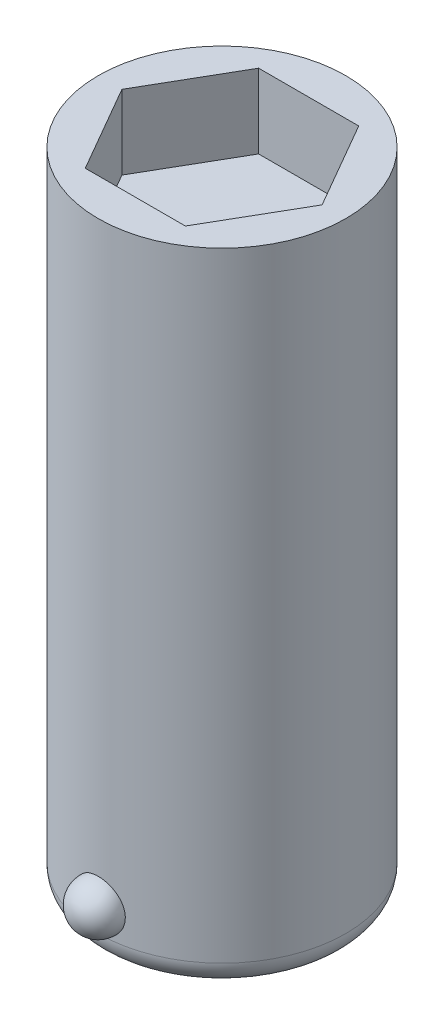
ISO-10303-21;
HEADER;
FILE_DESCRIPTION(('STEP AP214'),'2;1');
FILE_NAME('part.step','',(''),(''),'','','');
FILE_SCHEMA(('AUTOMOTIVE_DESIGN { 1 0 10303 214 1 1 1 1 }'));
ENDSEC;
DATA;
#1=APPLICATION_CONTEXT('core data for automotive mechanical design processes');
#2=APPLICATION_PROTOCOL_DEFINITION('international standard','automotive_design',2000,#1);
#3=PRODUCT_CONTEXT('',#1,'mechanical');
#4=PRODUCT('Part','Part','',(#3));
#5=PRODUCT_RELATED_PRODUCT_CATEGORY('part','',(#4));
#6=PRODUCT_DEFINITION_FORMATION('','',#4);
#7=PRODUCT_DEFINITION_CONTEXT('part definition',#1,'design');
#8=PRODUCT_DEFINITION('design','',#6,#7);
#9=PRODUCT_DEFINITION_SHAPE('','',#8);
#10=(LENGTH_UNIT() NAMED_UNIT(*) SI_UNIT(.MILLI.,.METRE.));
#11=(NAMED_UNIT(*) PLANE_ANGLE_UNIT() SI_UNIT($,.RADIAN.));
#12=(NAMED_UNIT(*) SI_UNIT($,.STERADIAN.) SOLID_ANGLE_UNIT());
#13=UNCERTAINTY_MEASURE_WITH_UNIT(LENGTH_MEASURE(1.E-05),#10,'distance_accuracy_value','');
#14=(GEOMETRIC_REPRESENTATION_CONTEXT(3) GLOBAL_UNCERTAINTY_ASSIGNED_CONTEXT((#13)) GLOBAL_UNIT_ASSIGNED_CONTEXT((#10,
#11,#12)) REPRESENTATION_CONTEXT('',''));
#15=CARTESIAN_POINT('',(0.,0.,0.));
#16=DIRECTION('',(0.,0.,1.));
#17=DIRECTION('',(1.,0.,0.));
#18=AXIS2_PLACEMENT_3D('',#15,#16,#17);
#19=CARTESIAN_POINT('',(0.,26.,0.));
#20=DIRECTION('',(0.,-1.,0.));
#21=DIRECTION('',(0.,0.,-1.));
#22=AXIS2_PLACEMENT_3D('',#19,#20,#21);
#23=CYLINDRICAL_SURFACE('',#22,5.);
#24=CARTESIAN_POINT('',(0.,0.994987437106618,0.));
#25=DIRECTION('',(0.,-1.,0.));
#26=DIRECTION('',(0.,0.,-1.));
#27=AXIS2_PLACEMENT_3D('',#24,#25,#26);
#28=CIRCLE('',#27,5.);
#29=CARTESIAN_POINT('',(0.,0.994987437106618,-5.));
#30=VERTEX_POINT('',#29);
#31=EDGE_CURVE('E11',#30,#30,#28,.F.);
#32=ORIENTED_EDGE('',*,*,#31,.T.);
#33=EDGE_LOOP('',(#32));
#34=FACE_BOUND('',#33,.T.);
#35=CARTESIAN_POINT('',(0.994987437106706,2.,4.9));
#36=CARTESIAN_POINT('',(0.99498560287014,1.94396831697695,4.90000106045254));
#37=CARTESIAN_POINT('',(0.990335655261199,1.88791073579904,4.90095166589253));
#38=CARTESIAN_POINT('',(0.971848665803341,1.77736226997428,4.90465044251787));
#39=CARTESIAN_POINT('',(0.958004476867156,1.72287263857011,4.9074000120923));
#40=CARTESIAN_POINT('',(0.92150239913956,1.61705676134784,4.91438464778238));
#41=CARTESIAN_POINT('',(0.898848550961522,1.56572907776405,4.91861903278939));
#42=CARTESIAN_POINT('',(0.845332865723616,1.46766063985218,4.92809773919241));
#43=CARTESIAN_POINT('',(0.814472092087265,1.4209192923168,4.93334192971722));
#44=CARTESIAN_POINT('',(0.745274823977119,1.33320334923897,4.94426858838759));
#45=CARTESIAN_POINT('',(0.706919382057819,1.29224383263132,4.94995214482173));
#46=CARTESIAN_POINT('',(0.623820502557111,1.21737996494551,4.96110891653895));
#47=CARTESIAN_POINT('',(0.579076950291243,1.18347574055645,4.96658212804351));
#48=CARTESIAN_POINT('',(0.484507997711316,1.12372488100045,4.97669635913741));
#49=CARTESIAN_POINT('',(0.434690387828699,1.09786613357938,4.98133862517423));
#50=CARTESIAN_POINT('',(0.331321767027698,1.05487587556066,4.9892794790187));
#51=CARTESIAN_POINT('',(0.277770967463711,1.03774387135421,4.9925781428221));
#52=CARTESIAN_POINT('',(0.168991770750412,1.01281938141677,4.99743703932135));
#53=CARTESIAN_POINT('',(0.113783790778077,1.00494090032989,4.99901326931134));
#54=CARTESIAN_POINT('',(0.00280574839069789,0.99846038664853,5.00030705156377));
#55=CARTESIAN_POINT('',(-0.0529642848279286,0.999857874659318,5.00002469988025));
#56=CARTESIAN_POINT('',(-0.163044634175729,1.01184263311872,4.99764204274201));
#57=CARTESIAN_POINT('',(-0.217362732615366,1.0223613211719,4.99555530481581));
#58=CARTESIAN_POINT('',(-0.323437202466647,1.05219813692466,4.98981075910898));
#59=CARTESIAN_POINT('',(-0.375193542531856,1.0715163722686,4.98615293210933));
#60=CARTESIAN_POINT('',(-0.474877061572509,1.1184919662299,4.97765055921629));
#61=CARTESIAN_POINT('',(-0.522790881371321,1.14617694707735,4.97280209260139));
#62=CARTESIAN_POINT('',(-0.613293841484466,1.20909823835989,4.96245389323851));
#63=CARTESIAN_POINT('',(-0.655882686619847,1.2443349671169,4.95695412441981));
#64=CARTESIAN_POINT('',(-0.734998232489791,1.32178820362403,4.94584600979191));
#65=CARTESIAN_POINT('',(-0.771459490548274,1.36407149538703,4.94023712834133));
#66=CARTESIAN_POINT('',(-0.836817313891344,1.45419241208939,4.92958788142729));
#67=CARTESIAN_POINT('',(-0.865713625679486,1.50203022307957,4.92454753501828));
#68=CARTESIAN_POINT('',(-0.915310830489436,1.60220741654454,4.91557197339426));
#69=CARTESIAN_POINT('',(-0.935966015304219,1.65456999811804,4.91164295605738));
#70=CARTESIAN_POINT('',(-0.968299634970496,1.76208737815018,4.90537147493131));
#71=CARTESIAN_POINT('',(-0.979978211499377,1.81724213252543,4.9030289861021));
#72=CARTESIAN_POINT('',(-0.994028344792453,1.92863330353786,4.90019997742686));
#73=CARTESIAN_POINT('',(-0.996422746224356,1.98486672257479,4.89970890207017));
#74=CARTESIAN_POINT('',(-0.991903453089489,2.09694201485401,4.90062573154923));
#75=CARTESIAN_POINT('',(-0.984989872516567,2.15278389288303,4.90203361312865));
#76=CARTESIAN_POINT('',(-0.962065978984036,2.26236209630438,4.90658369613697));
#77=CARTESIAN_POINT('',(-0.946076154978933,2.31610287370878,4.9097219908301));
#78=CARTESIAN_POINT('',(-0.905439545493827,2.42010030332156,4.91737776520369));
#79=CARTESIAN_POINT('',(-0.880792566721247,2.47035687770642,4.9218952756783));
#80=CARTESIAN_POINT('',(-0.823408707673632,2.5661269493201,4.93181965849537));
#81=CARTESIAN_POINT('',(-0.790647810994116,2.61162578500097,4.93722915484837));
#82=CARTESIAN_POINT('',(-0.717950321335968,2.69643891265726,4.94832250793488));
#83=CARTESIAN_POINT('',(-0.67801360527122,2.7357530985263,4.95400636937333));
#84=CARTESIAN_POINT('',(-0.591982999572354,2.8071506902601,4.96502123503072));
#85=CARTESIAN_POINT('',(-0.545880125493262,2.83922335796265,4.97035170706183));
#86=CARTESIAN_POINT('',(-0.448842527846835,2.89515463323769,4.98005164377887));
#87=CARTESIAN_POINT('',(-0.397907996873,2.91901356804045,4.98442114674673));
#88=CARTESIAN_POINT('',(-0.293023074529829,2.95769719834728,4.99168101894947));
#89=CARTESIAN_POINT('',(-0.239096258922929,2.97258389197869,4.99458151620528));
#90=CARTESIAN_POINT('',(-0.129451795906326,2.99315418320674,4.99862479266747));
#91=CARTESIAN_POINT('',(-0.0737342578870587,2.99883834187594,4.99976767903403));
#92=CARTESIAN_POINT('',(0.0373329284403417,3.00083043709395,5.00016608200714));
#93=CARTESIAN_POINT('',(0.0926809135385354,2.99722864866207,4.99943977048283));
#94=CARTESIAN_POINT('',(0.201969740239315,2.98094276533955,4.9962183365304));
#95=CARTESIAN_POINT('',(0.255910600391219,2.96825879023693,4.99372323743143));
#96=CARTESIAN_POINT('',(0.360808369575168,2.93418578849914,4.98724153108333));
#97=CARTESIAN_POINT('',(0.411768354992322,2.91280592438383,4.98325649407964));
#98=CARTESIAN_POINT('',(0.509361425920189,2.86193700219456,4.97422912870706));
#99=CARTESIAN_POINT('',(0.555994416538248,2.83244776633517,4.96918677715875));
#100=CARTESIAN_POINT('',(0.644060366517357,2.76587827308016,4.9585455278987));
#101=CARTESIAN_POINT('',(0.685444474177205,2.72873410956696,4.95294216351497));
#102=CARTESIAN_POINT('',(0.761429310549823,2.64803158579989,4.94183202558425));
#103=CARTESIAN_POINT('',(0.796028644006292,2.60447190944487,4.93632527211638));
#104=CARTESIAN_POINT('',(0.857786479384858,2.51174203804983,4.92597140076439));
#105=CARTESIAN_POINT('',(0.884877881447816,2.46252648196186,4.9211304146418));
#106=CARTESIAN_POINT('',(0.930477407488461,2.36019906325116,4.91271345168924));
#107=CARTESIAN_POINT('',(0.948992213438764,2.30709027131752,4.90913649058228));
#108=CARTESIAN_POINT('',(0.973597596884116,2.21158675404024,4.90430644223049));
#109=CARTESIAN_POINT('',(0.981606650553947,2.1696928322495,4.90270112417325));
#110=CARTESIAN_POINT('',(0.992302255052214,2.08520426359049,4.9005475024342));
#111=CARTESIAN_POINT('',(0.9949888319626,2.04260962015702,4.89999919357268));
#112=CARTESIAN_POINT('',(0.994987437106706,2.,4.9));
#113=B_SPLINE_CURVE_WITH_KNOTS('',3,(#35,#36,#37,#38,#39,#40,#41,#42,#43,#44,#45,#46,#47,#48,
#49,#50,#51,#52,#53,#54,#55,#56,#57,#58,#59,#60,#61,#62,#63,#64,#65,#66,#67,#68,#69,#70,#71,#72,
#73,#74,#75,#76,#77,#78,#79,#80,#81,#82,#83,#84,#85,#86,#87,#88,#89,#90,#91,#92,#93,#94,#95,#96,
#97,#98,#99,#100,#101,#102,#103,#104,#105,#106,#107,#108,#109,#110,#111,#112),.UNSPECIFIED.,.T.,
.F.,(4,2,2,2,2,2,2,2,2,2,2,2,2,2,2,2,2,2,2,2,2,2,2,2,2,2,2,2,2,2,2,2,2,2,2,2,2,2,4),(0.,
0.167940955561216,0.33601261204054,0.504007271996075,0.671980174412868,0.84038335945457,
1.00878956818505,1.17694100511984,1.34508292988629,1.51164958473181,1.67820763125236,
1.8435240797765,2.00884255066188,2.17471288450689,2.34059240895797,2.5081442138022,
2.67570163248039,2.84417587888589,3.01264746621567,3.18070424782688,3.34875897128358,
3.51643582372435,3.68411642020714,3.85229939390611,4.02048525270635,4.18891889328023,
4.3573458227807,4.52459516649013,4.69183431273185,4.85745375726807,5.02307101743411,
5.18851422334409,5.35396105662986,5.5208495278253,5.68777228292659,5.8561419895995,
6.02438029894246,6.15209260394204,6.27980428310625),.UNSPECIFIED.);
#114=CARTESIAN_POINT('',(0.994987437106706,2.,4.9));
#115=VERTEX_POINT('',#114);
#116=EDGE_CURVE('E45',#115,#115,#113,.T.);
#117=ORIENTED_EDGE('',*,*,#116,.T.);
#118=EDGE_LOOP('',(#117));
#119=FACE_BOUND('',#118,.T.);
#120=CARTESIAN_POINT('',(0.994987437106706,2.,-4.9));
#121=CARTESIAN_POINT('',(0.99498560287014,2.05603168302305,-4.90000106045254));
#122=CARTESIAN_POINT('',(0.990335655261199,2.11208926420096,-4.90095166589253));
#123=CARTESIAN_POINT('',(0.971848665803341,2.22263773002572,-4.90465044251787));
#124=CARTESIAN_POINT('',(0.958004476867156,2.27712736142989,-4.9074000120923));
#125=CARTESIAN_POINT('',(0.92150239913956,2.38294323865216,-4.91438464778238));
#126=CARTESIAN_POINT('',(0.898848550961522,2.43427092223595,-4.91861903278939));
#127=CARTESIAN_POINT('',(0.845332865723616,2.53233936014782,-4.92809773919241));
#128=CARTESIAN_POINT('',(0.814472092087265,2.5790807076832,-4.93334192971722));
#129=CARTESIAN_POINT('',(0.745274823977119,2.66679665076103,-4.94426858838759));
#130=CARTESIAN_POINT('',(0.706919382057818,2.70775616736868,-4.94995214482173));
#131=CARTESIAN_POINT('',(0.623820502557111,2.78262003505449,-4.96110891653895));
#132=CARTESIAN_POINT('',(0.579076950291242,2.81652425944355,-4.96658212804351));
#133=CARTESIAN_POINT('',(0.484507997711315,2.87627511899955,-4.97669635913741));
#134=CARTESIAN_POINT('',(0.434690387828699,2.90213386642062,-4.98133862517423));
#135=CARTESIAN_POINT('',(0.331321767027697,2.94512412443934,-4.9892794790187));
#136=CARTESIAN_POINT('',(0.27777096746371,2.96225612864579,-4.9925781428221));
#137=CARTESIAN_POINT('',(0.168991770750411,2.98718061858323,-4.99743703932135));
#138=CARTESIAN_POINT('',(0.113783790778076,2.99505909967011,-4.99901326931134));
#139=CARTESIAN_POINT('',(0.00280574839069695,3.00153961335147,-5.00030705156377));
#140=CARTESIAN_POINT('',(-0.0529642848279295,3.00014212534068,-5.00002469988025));
#141=CARTESIAN_POINT('',(-0.16304463417573,2.98815736688128,-4.99764204274201));
#142=CARTESIAN_POINT('',(-0.217362732615367,2.9776386788281,-4.99555530481581));
#143=CARTESIAN_POINT('',(-0.323437202466648,2.94780186307534,-4.98981075910898));
#144=CARTESIAN_POINT('',(-0.375193542531857,2.9284836277314,-4.98615293210933));
#145=CARTESIAN_POINT('',(-0.47487706157251,2.8815080337701,-4.97765055921629));
#146=CARTESIAN_POINT('',(-0.522790881371322,2.85382305292265,-4.97280209260139));
#147=CARTESIAN_POINT('',(-0.613293841484467,2.79090176164011,-4.96245389323851));
#148=CARTESIAN_POINT('',(-0.655882686619848,2.7556650328831,-4.95695412441981));
#149=CARTESIAN_POINT('',(-0.734998232489792,2.67821179637597,-4.94584600979191));
#150=CARTESIAN_POINT('',(-0.771459490548274,2.63592850461297,-4.94023712834133));
#151=CARTESIAN_POINT('',(-0.836817313891345,2.54580758791061,-4.92958788142729));
#152=CARTESIAN_POINT('',(-0.865713625679486,2.49796977692043,-4.92454753501828));
#153=CARTESIAN_POINT('',(-0.915310830489436,2.39779258345546,-4.91557197339426));
#154=CARTESIAN_POINT('',(-0.935966015304219,2.34543000188195,-4.91164295605738));
#155=CARTESIAN_POINT('',(-0.968299634970496,2.23791262184982,-4.90537147493131));
#156=CARTESIAN_POINT('',(-0.979978211499377,2.18275786747457,-4.9030289861021));
#157=CARTESIAN_POINT('',(-0.994028344792453,2.07136669646214,-4.90019997742686));
#158=CARTESIAN_POINT('',(-0.996422746224356,2.01513327742521,-4.89970890207017));
#159=CARTESIAN_POINT('',(-0.991903453089489,1.90305798514599,-4.90062573154923));
#160=CARTESIAN_POINT('',(-0.984989872516567,1.84721610711697,-4.90203361312865));
#161=CARTESIAN_POINT('',(-0.962065978984036,1.73763790369562,-4.90658369613697));
#162=CARTESIAN_POINT('',(-0.946076154978933,1.68389712629122,-4.9097219908301));
#163=CARTESIAN_POINT('',(-0.905439545493827,1.57989969667844,-4.91737776520369));
#164=CARTESIAN_POINT('',(-0.880792566721247,1.52964312229358,-4.9218952756783));
#165=CARTESIAN_POINT('',(-0.823408707673631,1.4338730506799,-4.93181965849537));
#166=CARTESIAN_POINT('',(-0.790647810994116,1.38837421499903,-4.93722915484837));
#167=CARTESIAN_POINT('',(-0.717950321335968,1.30356108734274,-4.94832250793488));
#168=CARTESIAN_POINT('',(-0.678013605271219,1.2642469014737,-4.95400636937333));
#169=CARTESIAN_POINT('',(-0.591982999572353,1.1928493097399,-4.96502123503072));
#170=CARTESIAN_POINT('',(-0.545880125493261,1.16077664203735,-4.97035170706183));
#171=CARTESIAN_POINT('',(-0.448842527846834,1.10484536676231,-4.98005164377887));
#172=CARTESIAN_POINT('',(-0.397907996872999,1.08098643195954,-4.98442114674673));
#173=CARTESIAN_POINT('',(-0.293023074529829,1.04230280165272,-4.99168101894947));
#174=CARTESIAN_POINT('',(-0.239096258922929,1.02741610802131,-4.99458151620528));
#175=CARTESIAN_POINT('',(-0.129451795906325,1.00684581679326,-4.99862479266747));
#176=CARTESIAN_POINT('',(-0.0737342578870582,1.00116165812406,-4.99976767903403));
#177=CARTESIAN_POINT('',(0.0373329284403422,0.999169562906053,-5.00016608200714));
#178=CARTESIAN_POINT('',(0.0926809135385359,1.00277135133793,-4.99943977048283));
#179=CARTESIAN_POINT('',(0.201969740239316,1.01905723466045,-4.9962183365304));
#180=CARTESIAN_POINT('',(0.25591060039122,1.03174120976307,-4.99372323743143));
#181=CARTESIAN_POINT('',(0.360808369575168,1.06581421150086,-4.98724153108333));
#182=CARTESIAN_POINT('',(0.411768354992323,1.08719407561617,-4.98325649407964));
#183=CARTESIAN_POINT('',(0.50936142592019,1.13806299780544,-4.97422912870706));
#184=CARTESIAN_POINT('',(0.555994416538249,1.16755223366483,-4.96918677715875));
#185=CARTESIAN_POINT('',(0.644060366517357,1.23412172691984,-4.9585455278987));
#186=CARTESIAN_POINT('',(0.685444474177205,1.27126589043305,-4.95294216351497));
#187=CARTESIAN_POINT('',(0.761429310549823,1.35196841420011,-4.94183202558424));
#188=CARTESIAN_POINT('',(0.796028644006292,1.39552809055514,-4.93632527211637));
#189=CARTESIAN_POINT('',(0.857786479384858,1.48825796195017,-4.92597140076439));
#190=CARTESIAN_POINT('',(0.884877881447817,1.53747351803814,-4.9211304146418));
#191=CARTESIAN_POINT('',(0.930477407488462,1.63980093674884,-4.91271345168924));
#192=CARTESIAN_POINT('',(0.948992213438764,1.69290972868248,-4.90913649058228));
#193=CARTESIAN_POINT('',(0.973597596884117,1.78841324595976,-4.90430644223049));
#194=CARTESIAN_POINT('',(0.981606650553948,1.8303071677505,-4.90270112417325));
#195=CARTESIAN_POINT('',(0.992302255052214,1.91479573640951,-4.9005475024342));
#196=CARTESIAN_POINT('',(0.9949888319626,1.95739037984298,-4.89999919357268));
#197=CARTESIAN_POINT('',(0.994987437106706,2.,-4.9));
#198=B_SPLINE_CURVE_WITH_KNOTS('',3,(#120,#121,#122,#123,#124,#125,#126,#127,#128,#129,#130,
#131,#132,#133,#134,#135,#136,#137,#138,#139,#140,#141,#142,#143,#144,#145,#146,#147,#148,#149,
#150,#151,#152,#153,#154,#155,#156,#157,#158,#159,#160,#161,#162,#163,#164,#165,#166,#167,#168,
#169,#170,#171,#172,#173,#174,#175,#176,#177,#178,#179,#180,#181,#182,#183,#184,#185,#186,#187,
#188,#189,#190,#191,#192,#193,#194,#195,#196,#197),.UNSPECIFIED.,.T.,.F.,(4,2,2,2,2,2,2,2,2,2,2,
2,2,2,2,2,2,2,2,2,2,2,2,2,2,2,2,2,2,2,2,2,2,2,2,2,2,2,4),(0.,0.167940955561216,0.33601261204054,
0.504007271996074,0.671980174412868,0.840383359454571,1.00878956818505,1.17694100511984,
1.34508292988629,1.51164958473181,1.67820763125236,1.8435240797765,2.00884255066188,
2.17471288450689,2.34059240895797,2.5081442138022,2.67570163248039,2.84417587888589,
3.01264746621567,3.18070424782688,3.34875897128358,3.51643582372435,3.68411642020714,
3.85229939390611,4.02048525270635,4.18891889328023,4.3573458227807,4.52459516649013,
4.69183431273185,4.85745375726808,5.02307101743411,5.18851422334409,5.35396105662986,
5.52084952782531,5.68777228292659,5.85614198959951,6.02438029894246,6.15209260394204,
6.27980428310625),.UNSPECIFIED.);
#199=CARTESIAN_POINT('',(0.994987437106706,2.,-4.9));
#200=VERTEX_POINT('',#199);
#201=EDGE_CURVE('E148',#200,#200,#198,.T.);
#202=ORIENTED_EDGE('',*,*,#201,.T.);
#203=EDGE_LOOP('',(#202));
#204=FACE_BOUND('',#203,.T.);
#205=CARTESIAN_POINT('',(0.,26.,0.));
#206=DIRECTION('',(0.,1.,0.));
#207=DIRECTION('',(0.,0.,1.));
#208=AXIS2_PLACEMENT_3D('',#205,#206,#207);
#209=CIRCLE('',#208,5.);
#210=CARTESIAN_POINT('',(0.,26.,5.));
#211=VERTEX_POINT('',#210);
#212=EDGE_CURVE('E145',#211,#211,#209,.T.);
#213=ORIENTED_EDGE('',*,*,#212,.F.);
#214=EDGE_LOOP('',(#213));
#215=FACE_BOUND('',#214,.T.);
#216=ADVANCED_FACE('F37',(#34,#119,#204,#215),#23,.T.);
#217=CARTESIAN_POINT('',(0.,26.,0.));
#218=DIRECTION('',(0.,1.,0.));
#219=DIRECTION('',(0.,0.,1.));
#220=AXIS2_PLACEMENT_3D('',#217,#218,#219);
#221=PLANE('',#220);
#222=DIRECTION('',(-0.5,0.,0.866025403784439));
#223=VECTOR('',#222,1.);
#224=CARTESIAN_POINT('',(-2.02072594216369,26.,-3.5));
#225=LINE('',#224,#223);
#226=CARTESIAN_POINT('',(-2.02072594216369,26.,-3.5));
#227=VERTEX_POINT('',#226);
#228=CARTESIAN_POINT('',(-4.04145188432738,26.,0.));
#229=VERTEX_POINT('',#228);
#230=EDGE_CURVE('E52',#227,#229,#225,.T.);
#231=ORIENTED_EDGE('',*,*,#230,.F.);
#232=DIRECTION('',(-1.,0.,0.));
#233=VECTOR('',#232,1.);
#234=CARTESIAN_POINT('',(2.02072594216369,26.,-3.5));
#235=LINE('',#234,#233);
#236=CARTESIAN_POINT('',(2.02072594216369,26.,-3.5));
#237=VERTEX_POINT('',#236);
#238=EDGE_CURVE('E135',#237,#227,#235,.T.);
#239=ORIENTED_EDGE('',*,*,#238,.F.);
#240=DIRECTION('',(-0.5,0.,-0.866025403784439));
#241=VECTOR('',#240,1.);
#242=CARTESIAN_POINT('',(4.04145188432738,26.,0.));
#243=LINE('',#242,#241);
#244=CARTESIAN_POINT('',(4.04145188432738,26.,0.));
#245=VERTEX_POINT('',#244);
#246=EDGE_CURVE('E133',#245,#237,#243,.T.);
#247=ORIENTED_EDGE('',*,*,#246,.F.);
#248=DIRECTION('',(0.5,0.,-0.866025403784439));
#249=VECTOR('',#248,1.);
#250=CARTESIAN_POINT('',(2.02072594216369,26.,3.5));
#251=LINE('',#250,#249);
#252=CARTESIAN_POINT('',(2.02072594216369,26.,3.5));
#253=VERTEX_POINT('',#252);
#254=EDGE_CURVE('E100',#253,#245,#251,.T.);
#255=ORIENTED_EDGE('',*,*,#254,.F.);
#256=DIRECTION('',(1.,0.,0.));
#257=VECTOR('',#256,1.);
#258=CARTESIAN_POINT('',(-2.02072594216369,26.,3.5));
#259=LINE('',#258,#257);
#260=CARTESIAN_POINT('',(-2.02072594216369,26.,3.5));
#261=VERTEX_POINT('',#260);
#262=EDGE_CURVE('E129',#261,#253,#259,.T.);
#263=ORIENTED_EDGE('',*,*,#262,.F.);
#264=DIRECTION('',(0.5,0.,0.866025403784439));
#265=VECTOR('',#264,1.);
#266=CARTESIAN_POINT('',(-4.04145188432738,26.,0.));
#267=LINE('',#266,#265);
#268=EDGE_CURVE('E126',#229,#261,#267,.T.);
#269=ORIENTED_EDGE('',*,*,#268,.F.);
#270=EDGE_LOOP('',(#231,#239,#247,#255,#263,#269));
#271=FACE_BOUND('',#270,.T.);
#272=ORIENTED_EDGE('',*,*,#212,.T.);
#273=EDGE_LOOP('',(#272));
#274=FACE_BOUND('',#273,.T.);
#275=ADVANCED_FACE('F172',(#271,#274),#221,.T.);
#276=CARTESIAN_POINT('',(0.,0.,0.));
#277=DIRECTION('',(0.,-1.,0.));
#278=DIRECTION('',(-1.,0.,0.));
#279=AXIS2_PLACEMENT_3D('',#276,#277,#278);
#280=SPHERICAL_SURFACE('',#279,4.1);
#281=CARTESIAN_POINT('',(0.,0.,0.));
#282=DIRECTION('',(0.,1.,0.));
#283=DIRECTION('',(0.,0.,1.));
#284=AXIS2_PLACEMENT_3D('',#281,#282,#283);
#285=CIRCLE('',#284,4.1);
#286=CARTESIAN_POINT('',(0.,0.,4.1));
#287=VERTEX_POINT('',#286);
#288=EDGE_CURVE('E139',#287,#287,#285,.T.);
#289=ORIENTED_EDGE('',*,*,#288,.F.);
#290=EDGE_LOOP('',(#289));
#291=FACE_BOUND('',#290,.T.);
#292=ADVANCED_FACE('F168',(#291),#280,.F.);
#293=CARTESIAN_POINT('',(0.,2.,-5.));
#294=DIRECTION('',(0.,0.,1.));
#295=DIRECTION('',(1.,0.,0.));
#296=AXIS2_PLACEMENT_3D('',#293,#294,#295);
#297=SPHERICAL_SURFACE('',#296,1.);
#298=ORIENTED_EDGE('',*,*,#201,.F.);
#299=EDGE_LOOP('',(#298));
#300=FACE_BOUND('',#299,.T.);
#301=ADVANCED_FACE('F162',(#300),#297,.T.);
#302=CARTESIAN_POINT('',(-2.02072594216369,23.,-3.5));
#303=DIRECTION('',(-0.866025403784439,0.,-0.5));
#304=DIRECTION('',(-0.5,0.,0.866025403784439));
#305=AXIS2_PLACEMENT_3D('',#302,#303,#304);
#306=PLANE('',#305);
#307=ORIENTED_EDGE('',*,*,#230,.T.);
#308=DIRECTION('',(0.,1.,0.));
#309=VECTOR('',#308,1.);
#310=CARTESIAN_POINT('',(-4.04145188432738,23.,0.));
#311=LINE('',#310,#309);
#312=CARTESIAN_POINT('',(-4.04145188432738,23.,0.));
#313=VERTEX_POINT('',#312);
#314=EDGE_CURVE('E82',#313,#229,#311,.T.);
#315=ORIENTED_EDGE('',*,*,#314,.F.);
#316=DIRECTION('',(-0.5,0.,0.866025403784439));
#317=VECTOR('',#316,1.);
#318=CARTESIAN_POINT('',(-2.02072594216369,23.,-3.5));
#319=LINE('',#318,#317);
#320=CARTESIAN_POINT('',(-2.02072594216369,23.,-3.5));
#321=VERTEX_POINT('',#320);
#322=EDGE_CURVE('E137',#321,#313,#319,.T.);
#323=ORIENTED_EDGE('',*,*,#322,.F.);
#324=DIRECTION('',(0.,1.,0.));
#325=VECTOR('',#324,1.);
#326=CARTESIAN_POINT('',(-2.02072594216369,23.,-3.5));
#327=LINE('',#326,#325);
#328=EDGE_CURVE('E60',#321,#227,#327,.T.);
#329=ORIENTED_EDGE('',*,*,#328,.T.);
#330=EDGE_LOOP('',(#307,#315,#323,#329));
#331=FACE_BOUND('',#330,.T.);
#332=ADVANCED_FACE('F167',(#331),#306,.F.);
#333=CARTESIAN_POINT('',(2.02072594216369,23.,-3.5));
#334=DIRECTION('',(0.,0.,-1.));
#335=DIRECTION('',(-1.,0.,0.));
#336=AXIS2_PLACEMENT_3D('',#333,#334,#335);
#337=PLANE('',#336);
#338=ORIENTED_EDGE('',*,*,#238,.T.);
#339=ORIENTED_EDGE('',*,*,#328,.F.);
#340=DIRECTION('',(-1.,0.,0.));
#341=VECTOR('',#340,1.);
#342=CARTESIAN_POINT('',(2.02072594216369,23.,-3.5));
#343=LINE('',#342,#341);
#344=CARTESIAN_POINT('',(2.02072594216369,23.,-3.5));
#345=VERTEX_POINT('',#344);
#346=EDGE_CURVE('E112',#345,#321,#343,.T.);
#347=ORIENTED_EDGE('',*,*,#346,.F.);
#348=DIRECTION('',(0.,1.,0.));
#349=VECTOR('',#348,1.);
#350=CARTESIAN_POINT('',(2.02072594216369,23.,-3.5));
#351=LINE('',#350,#349);
#352=EDGE_CURVE('E104',#345,#237,#351,.T.);
#353=ORIENTED_EDGE('',*,*,#352,.T.);
#354=EDGE_LOOP('',(#338,#339,#347,#353));
#355=FACE_BOUND('',#354,.T.);
#356=ADVANCED_FACE('F190',(#355),#337,.F.);
#357=CARTESIAN_POINT('',(4.04145188432738,23.,0.));
#358=DIRECTION('',(0.866025403784439,0.,-0.5));
#359=DIRECTION('',(-0.5,0.,-0.866025403784439));
#360=AXIS2_PLACEMENT_3D('',#357,#358,#359);
#361=PLANE('',#360);
#362=ORIENTED_EDGE('',*,*,#246,.T.);
#363=ORIENTED_EDGE('',*,*,#352,.F.);
#364=DIRECTION('',(-0.5,0.,-0.866025403784439));
#365=VECTOR('',#364,1.);
#366=CARTESIAN_POINT('',(4.04145188432738,23.,0.));
#367=LINE('',#366,#365);
#368=CARTESIAN_POINT('',(4.04145188432738,23.,0.));
#369=VERTEX_POINT('',#368);
#370=EDGE_CURVE('E108',#369,#345,#367,.T.);
#371=ORIENTED_EDGE('',*,*,#370,.F.);
#372=DIRECTION('',(0.,1.,0.));
#373=VECTOR('',#372,1.);
#374=CARTESIAN_POINT('',(4.04145188432738,23.,0.));
#375=LINE('',#374,#373);
#376=EDGE_CURVE('E93',#369,#245,#375,.T.);
#377=ORIENTED_EDGE('',*,*,#376,.T.);
#378=EDGE_LOOP('',(#362,#363,#371,#377));
#379=FACE_BOUND('',#378,.T.);
#380=ADVANCED_FACE('F109',(#379),#361,.F.);
#381=CARTESIAN_POINT('',(2.02072594216369,23.,3.5));
#382=DIRECTION('',(0.866025403784439,0.,0.5));
#383=DIRECTION('',(0.5,0.,-0.866025403784439));
#384=AXIS2_PLACEMENT_3D('',#381,#382,#383);
#385=PLANE('',#384);
#386=ORIENTED_EDGE('',*,*,#254,.T.);
#387=ORIENTED_EDGE('',*,*,#376,.F.);
#388=DIRECTION('',(0.5,0.,-0.866025403784439));
#389=VECTOR('',#388,1.);
#390=CARTESIAN_POINT('',(2.02072594216369,23.,3.5));
#391=LINE('',#390,#389);
#392=CARTESIAN_POINT('',(2.02072594216369,23.,3.5));
#393=VERTEX_POINT('',#392);
#394=EDGE_CURVE('E97',#393,#369,#391,.T.);
#395=ORIENTED_EDGE('',*,*,#394,.F.);
#396=DIRECTION('',(0.,1.,0.));
#397=VECTOR('',#396,1.);
#398=CARTESIAN_POINT('',(2.02072594216369,23.,3.5));
#399=LINE('',#398,#397);
#400=EDGE_CURVE('E105',#393,#253,#399,.T.);
#401=ORIENTED_EDGE('',*,*,#400,.T.);
#402=EDGE_LOOP('',(#386,#387,#395,#401));
#403=FACE_BOUND('',#402,.T.);
#404=ADVANCED_FACE('F95',(#403),#385,.F.);
#405=CARTESIAN_POINT('',(-2.02072594216369,23.,3.5));
#406=DIRECTION('',(0.,0.,1.));
#407=DIRECTION('',(1.,0.,0.));
#408=AXIS2_PLACEMENT_3D('',#405,#406,#407);
#409=PLANE('',#408);
#410=ORIENTED_EDGE('',*,*,#262,.T.);
#411=ORIENTED_EDGE('',*,*,#400,.F.);
#412=DIRECTION('',(1.,0.,0.));
#413=VECTOR('',#412,1.);
#414=CARTESIAN_POINT('',(-2.02072594216369,23.,3.5));
#415=LINE('',#414,#413);
#416=CARTESIAN_POINT('',(-2.02072594216369,23.,3.5));
#417=VERTEX_POINT('',#416);
#418=EDGE_CURVE('E118',#417,#393,#415,.T.);
#419=ORIENTED_EDGE('',*,*,#418,.F.);
#420=DIRECTION('',(0.,1.,0.));
#421=VECTOR('',#420,1.);
#422=CARTESIAN_POINT('',(-2.02072594216369,23.,3.5));
#423=LINE('',#422,#421);
#424=EDGE_CURVE('E142',#417,#261,#423,.T.);
#425=ORIENTED_EDGE('',*,*,#424,.T.);
#426=EDGE_LOOP('',(#410,#411,#419,#425));
#427=FACE_BOUND('',#426,.T.);
#428=ADVANCED_FACE('F203',(#427),#409,.F.);
#429=CARTESIAN_POINT('',(-4.04145188432738,23.,0.));
#430=DIRECTION('',(-0.866025403784439,0.,0.5));
#431=DIRECTION('',(0.5,0.,0.866025403784439));
#432=AXIS2_PLACEMENT_3D('',#429,#430,#431);
#433=PLANE('',#432);
#434=ORIENTED_EDGE('',*,*,#268,.T.);
#435=ORIENTED_EDGE('',*,*,#424,.F.);
#436=DIRECTION('',(0.5,0.,0.866025403784439));
#437=VECTOR('',#436,1.);
#438=CARTESIAN_POINT('',(-4.04145188432738,23.,0.));
#439=LINE('',#438,#437);
#440=EDGE_CURVE('E120',#313,#417,#439,.T.);
#441=ORIENTED_EDGE('',*,*,#440,.F.);
#442=ORIENTED_EDGE('',*,*,#314,.T.);
#443=EDGE_LOOP('',(#434,#435,#441,#442));
#444=FACE_BOUND('',#443,.T.);
#445=ADVANCED_FACE('F187',(#444),#433,.F.);
#446=CARTESIAN_POINT('',(0.,23.,0.));
#447=DIRECTION('',(0.,1.,0.));
#448=DIRECTION('',(0.,0.,1.));
#449=AXIS2_PLACEMENT_3D('',#446,#447,#448);
#450=PLANE('',#449);
#451=ORIENTED_EDGE('',*,*,#322,.T.);
#452=ORIENTED_EDGE('',*,*,#440,.T.);
#453=ORIENTED_EDGE('',*,*,#418,.T.);
#454=ORIENTED_EDGE('',*,*,#394,.T.);
#455=ORIENTED_EDGE('',*,*,#370,.T.);
#456=ORIENTED_EDGE('',*,*,#346,.T.);
#457=EDGE_LOOP('',(#451,#452,#453,#454,#455,#456));
#458=FACE_BOUND('',#457,.T.);
#459=ADVANCED_FACE('F115',(#458),#450,.T.);
#460=CARTESIAN_POINT('',(0.,2.,5.));
#461=DIRECTION('',(0.,0.,-1.));
#462=DIRECTION('',(1.,0.,0.));
#463=AXIS2_PLACEMENT_3D('',#460,#461,#462);
#464=SPHERICAL_SURFACE('',#463,1.);
#465=ORIENTED_EDGE('',*,*,#116,.F.);
#466=EDGE_LOOP('',(#465));
#467=FACE_BOUND('',#466,.T.);
#468=ADVANCED_FACE('F210',(#467),#464,.T.);
#469=CARTESIAN_POINT('',(0.,0.99498743710662,0.));
#470=DIRECTION('',(0.,-1.,0.));
#471=DIRECTION('',(0.,0.,-1.));
#472=AXIS2_PLACEMENT_3D('',#469,#470,#471);
#473=TOROIDAL_SURFACE('',#472,4.,1.);
#474=ORIENTED_EDGE('',*,*,#288,.T.);
#475=EDGE_LOOP('',(#474));
#476=FACE_BOUND('',#475,.T.);
#477=ORIENTED_EDGE('',*,*,#31,.F.);
#478=EDGE_LOOP('',(#477));
#479=FACE_BOUND('',#478,.T.);
#480=ADVANCED_FACE('F39',(#476,#479),#473,.T.);
#481=CLOSED_SHELL('',(#216,#275,#292,#301,#332,#356,#380,#404,#428,#445,#459,#468,#480));
#482=MANIFOLD_SOLID_BREP('B2',#481);
#483=ADVANCED_BREP_SHAPE_REPRESENTATION('',(#18,#482),#14);
#484=SHAPE_DEFINITION_REPRESENTATION(#9,#483);
ENDSEC;
END-ISO-10303-21;
